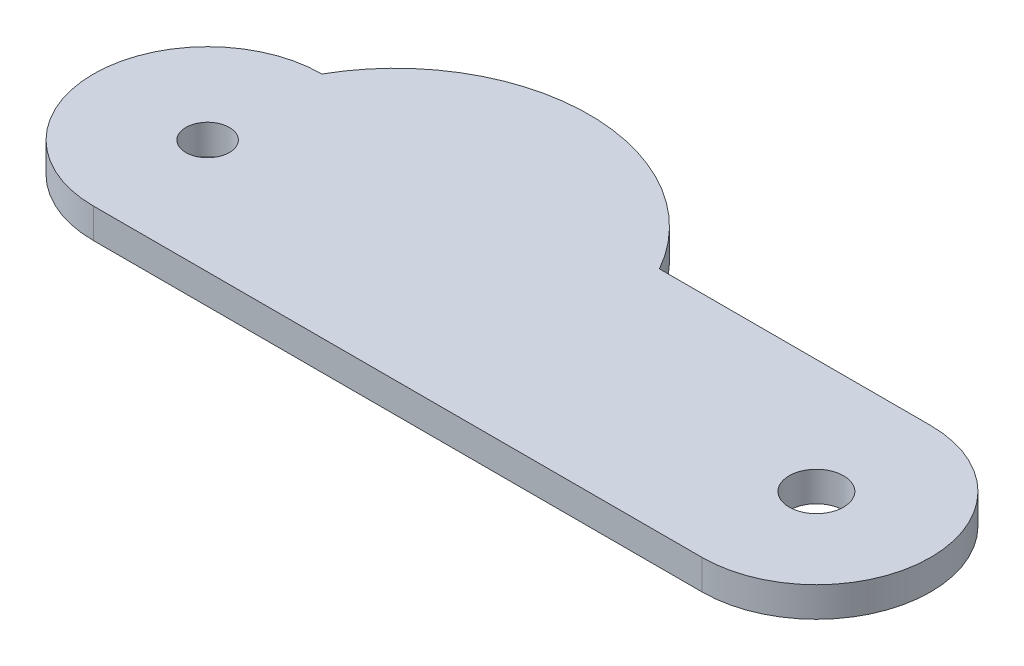
ISO-10303-21;
HEADER;
FILE_DESCRIPTION(('STEP AP214'),'2;1');
FILE_NAME('part.step','',(''),(''),'','','');
FILE_SCHEMA(('AUTOMOTIVE_DESIGN { 1 0 10303 214 1 1 1 1 }'));
ENDSEC;
DATA;
#1=APPLICATION_CONTEXT('core data for automotive mechanical design processes');
#2=APPLICATION_PROTOCOL_DEFINITION('international standard','automotive_design',2000,#1);
#3=PRODUCT_CONTEXT('',#1,'mechanical');
#4=PRODUCT('Part','Part','',(#3));
#5=PRODUCT_RELATED_PRODUCT_CATEGORY('part','',(#4));
#6=PRODUCT_DEFINITION_FORMATION('','',#4);
#7=PRODUCT_DEFINITION_CONTEXT('part definition',#1,'design');
#8=PRODUCT_DEFINITION('design','',#6,#7);
#9=PRODUCT_DEFINITION_SHAPE('','',#8);
#10=(LENGTH_UNIT() NAMED_UNIT(*) SI_UNIT(.MILLI.,.METRE.));
#11=(NAMED_UNIT(*) PLANE_ANGLE_UNIT() SI_UNIT($,.RADIAN.));
#12=(NAMED_UNIT(*) SI_UNIT($,.STERADIAN.) SOLID_ANGLE_UNIT());
#13=UNCERTAINTY_MEASURE_WITH_UNIT(LENGTH_MEASURE(1.E-05),#10,'distance_accuracy_value','');
#14=(GEOMETRIC_REPRESENTATION_CONTEXT(3) GLOBAL_UNCERTAINTY_ASSIGNED_CONTEXT((#13)) GLOBAL_UNIT_ASSIGNED_CONTEXT((#10,
#11,#12)) REPRESENTATION_CONTEXT('',''));
#15=CARTESIAN_POINT('',(0.,0.,0.));
#16=DIRECTION('',(0.,0.,1.));
#17=DIRECTION('',(1.,0.,0.));
#18=AXIS2_PLACEMENT_3D('',#15,#16,#17);
#19=CARTESIAN_POINT('',(0.,2.,0.));
#20=DIRECTION('',(0.,-1.,0.));
#21=DIRECTION('',(0.,0.,-1.));
#22=AXIS2_PLACEMENT_3D('',#19,#20,#21);
#23=PLANE('',#22);
#24=DIRECTION('',(1.,0.,0.));
#25=VECTOR('',#24,1.);
#26=CARTESIAN_POINT('',(0.,2.,10.5003992165423));
#27=LINE('',#26,#25);
#28=CARTESIAN_POINT('',(-55.9305382801715,2.,10.5003992165423));
#29=VERTEX_POINT('',#28);
#30=CARTESIAN_POINT('',(0.,2.,10.5003992165423));
#31=VERTEX_POINT('',#30);
#32=EDGE_CURVE('E84',#29,#31,#27,.T.);
#33=ORIENTED_EDGE('',*,*,#32,.F.);
#34=CARTESIAN_POINT('',(-55.9305382801715,2.,0.));
#35=DIRECTION('',(0.,-1.,0.));
#36=DIRECTION('',(0.,0.,-1.));
#37=AXIS2_PLACEMENT_3D('',#34,#35,#36);
#38=CIRCLE('',#37,10.5003992165423);
#39=CARTESIAN_POINT('',(-55.9305382801715,2.,-10.5003992165423));
#40=VERTEX_POINT('',#39);
#41=EDGE_CURVE('E88',#29,#40,#38,.T.);
#42=ORIENTED_EDGE('',*,*,#41,.T.);
#43=CARTESIAN_POINT('',(-40.4241193156667,2.,-1.7460511013579));
#44=DIRECTION('',(0.,1.,0.));
#45=DIRECTION('',(0.,0.,1.));
#46=AXIS2_PLACEMENT_3D('',#43,#44,#45);
#47=CIRCLE('',#46,17.8069548217708);
#48=CARTESIAN_POINT('',(-24.917700351162,2.,-10.5003992165423));
#49=VERTEX_POINT('',#48);
#50=EDGE_CURVE('E11',#49,#40,#47,.T.);
#51=ORIENTED_EDGE('',*,*,#50,.F.);
#52=DIRECTION('',(1.,0.,0.));
#53=VECTOR('',#52,1.);
#54=CARTESIAN_POINT('',(0.,2.,-10.5003992165423));
#55=LINE('',#54,#53);
#56=CARTESIAN_POINT('',(0.,2.,-10.5003992165423));
#57=VERTEX_POINT('',#56);
#58=EDGE_CURVE('E109',#49,#57,#55,.T.);
#59=ORIENTED_EDGE('',*,*,#58,.T.);
#60=CARTESIAN_POINT('',(0.,2.,0.));
#61=DIRECTION('',(0.,-1.,0.));
#62=DIRECTION('',(0.,0.,-1.));
#63=AXIS2_PLACEMENT_3D('',#60,#61,#62);
#64=CIRCLE('',#63,10.5003992165423);
#65=EDGE_CURVE('E91',#57,#31,#64,.T.);
#66=ORIENTED_EDGE('',*,*,#65,.T.);
#67=EDGE_LOOP('',(#33,#42,#51,#59,#66));
#68=FACE_BOUND('',#67,.T.);
#69=CARTESIAN_POINT('',(0.,2.,0.));
#70=DIRECTION('',(0.,-1.,0.));
#71=DIRECTION('',(0.,0.,-1.));
#72=AXIS2_PLACEMENT_3D('',#69,#70,#71);
#73=CIRCLE('',#72,2.5);
#74=CARTESIAN_POINT('',(0.,2.,-2.5));
#75=VERTEX_POINT('',#74);
#76=EDGE_CURVE('E136',#75,#75,#73,.T.);
#77=ORIENTED_EDGE('',*,*,#76,.F.);
#78=EDGE_LOOP('',(#77));
#79=FACE_BOUND('',#78,.T.);
#80=CARTESIAN_POINT('',(-55.9305382801715,2.,0.));
#81=DIRECTION('',(0.,-1.,0.));
#82=DIRECTION('',(0.,0.,-1.));
#83=AXIS2_PLACEMENT_3D('',#80,#81,#82);
#84=CIRCLE('',#83,2.);
#85=CARTESIAN_POINT('',(-55.9305382801715,2.,-2.));
#86=VERTEX_POINT('',#85);
#87=EDGE_CURVE('E96',#86,#86,#84,.T.);
#88=ORIENTED_EDGE('',*,*,#87,.F.);
#89=EDGE_LOOP('',(#88));
#90=FACE_BOUND('',#89,.T.);
#91=ADVANCED_FACE('F38',(#68,#79,#90),#23,.T.);
#92=CARTESIAN_POINT('',(0.,4.75,-10.5003992165423));
#93=DIRECTION('',(0.,0.,1.));
#94=DIRECTION('',(1.,0.,0.));
#95=AXIS2_PLACEMENT_3D('',#92,#93,#94);
#96=PLANE('',#95);
#97=ORIENTED_EDGE('',*,*,#58,.F.);
#98=DIRECTION('',(0.,-1.,0.));
#99=VECTOR('',#98,1.);
#100=CARTESIAN_POINT('',(-24.917700351162,37.0570550282,-10.5003992165423));
#101=LINE('',#100,#99);
#102=CARTESIAN_POINT('',(-24.917700351162,4.75,-10.5003992165423));
#103=VERTEX_POINT('',#102);
#104=EDGE_CURVE('E42',#103,#49,#101,.T.);
#105=ORIENTED_EDGE('',*,*,#104,.F.);
#106=DIRECTION('',(-1.,0.,0.));
#107=VECTOR('',#106,1.);
#108=CARTESIAN_POINT('',(0.,4.75,-10.5003992165423));
#109=LINE('',#108,#107);
#110=CARTESIAN_POINT('',(0.,4.75,-10.5003992165423));
#111=VERTEX_POINT('',#110);
#112=EDGE_CURVE('E120',#111,#103,#109,.T.);
#113=ORIENTED_EDGE('',*,*,#112,.F.);
#114=DIRECTION('',(0.,-1.,0.));
#115=VECTOR('',#114,1.);
#116=CARTESIAN_POINT('',(0.,4.75,-10.5003992165423));
#117=LINE('',#116,#115);
#118=EDGE_CURVE('E95',#111,#57,#117,.T.);
#119=ORIENTED_EDGE('',*,*,#118,.T.);
#120=EDGE_LOOP('',(#97,#105,#113,#119));
#121=FACE_BOUND('',#120,.T.);
#122=ADVANCED_FACE('F142',(#121),#96,.F.);
#123=CARTESIAN_POINT('',(0.,4.75,0.));
#124=DIRECTION('',(0.,1.,0.));
#125=DIRECTION('',(0.,0.,1.));
#126=AXIS2_PLACEMENT_3D('',#123,#124,#125);
#127=PLANE('',#126);
#128=CARTESIAN_POINT('',(0.,4.75,0.));
#129=DIRECTION('',(0.,1.,0.));
#130=DIRECTION('',(0.,0.,1.));
#131=AXIS2_PLACEMENT_3D('',#128,#129,#130);
#132=CIRCLE('',#131,2.5);
#133=CARTESIAN_POINT('',(0.,4.75,2.5));
#134=VERTEX_POINT('',#133);
#135=EDGE_CURVE('E127',#134,#134,#132,.T.);
#136=ORIENTED_EDGE('',*,*,#135,.F.);
#137=EDGE_LOOP('',(#136));
#138=FACE_BOUND('',#137,.T.);
#139=CARTESIAN_POINT('',(0.,4.75,0.));
#140=DIRECTION('',(0.,1.,0.));
#141=DIRECTION('',(0.,0.,1.));
#142=AXIS2_PLACEMENT_3D('',#139,#140,#141);
#143=CIRCLE('',#142,10.5003992165423);
#144=CARTESIAN_POINT('',(0.,4.75,10.5003992165423));
#145=VERTEX_POINT('',#144);
#146=EDGE_CURVE('E125',#145,#111,#143,.T.);
#147=ORIENTED_EDGE('',*,*,#146,.T.);
#148=ORIENTED_EDGE('',*,*,#112,.T.);
#149=CARTESIAN_POINT('',(-40.4241193156667,4.75,-1.7460511013579));
#150=DIRECTION('',(0.,1.,0.));
#151=DIRECTION('',(0.,0.,1.));
#152=AXIS2_PLACEMENT_3D('',#149,#150,#151);
#153=CIRCLE('',#152,17.8069548217708);
#154=CARTESIAN_POINT('',(-55.9305382801715,4.75,-10.5003992165423));
#155=VERTEX_POINT('',#154);
#156=EDGE_CURVE('E54',#103,#155,#153,.T.);
#157=ORIENTED_EDGE('',*,*,#156,.T.);
#158=CARTESIAN_POINT('',(-55.9305382801715,4.75,0.));
#159=DIRECTION('',(0.,1.,0.));
#160=DIRECTION('',(0.,0.,1.));
#161=AXIS2_PLACEMENT_3D('',#158,#159,#160);
#162=CIRCLE('',#161,10.5003992165423);
#163=CARTESIAN_POINT('',(-55.9305382801715,4.75,10.5003992165423));
#164=VERTEX_POINT('',#163);
#165=EDGE_CURVE('E116',#155,#164,#162,.T.);
#166=ORIENTED_EDGE('',*,*,#165,.T.);
#167=DIRECTION('',(1.,0.,0.));
#168=VECTOR('',#167,1.);
#169=CARTESIAN_POINT('',(0.,4.75,10.5003992165423));
#170=LINE('',#169,#168);
#171=EDGE_CURVE('E102',#164,#145,#170,.T.);
#172=ORIENTED_EDGE('',*,*,#171,.T.);
#173=EDGE_LOOP('',(#147,#148,#157,#166,#172));
#174=FACE_BOUND('',#173,.T.);
#175=CARTESIAN_POINT('',(-55.9305382801715,4.75,0.));
#176=DIRECTION('',(0.,1.,0.));
#177=DIRECTION('',(0.,0.,1.));
#178=AXIS2_PLACEMENT_3D('',#175,#176,#177);
#179=CIRCLE('',#178,2.);
#180=CARTESIAN_POINT('',(-55.9305382801715,4.75,2.));
#181=VERTEX_POINT('',#180);
#182=EDGE_CURVE('E130',#181,#181,#179,.T.);
#183=ORIENTED_EDGE('',*,*,#182,.F.);
#184=EDGE_LOOP('',(#183));
#185=FACE_BOUND('',#184,.T.);
#186=ADVANCED_FACE('F143',(#138,#174,#185),#127,.T.);
#187=CARTESIAN_POINT('',(-55.9305382801715,4.75,0.));
#188=DIRECTION('',(0.,-1.,0.));
#189=DIRECTION('',(0.,0.,-1.));
#190=AXIS2_PLACEMENT_3D('',#187,#188,#189);
#191=CYLINDRICAL_SURFACE('',#190,10.5003992165423);
#192=ORIENTED_EDGE('',*,*,#41,.F.);
#193=DIRECTION('',(0.,-1.,0.));
#194=VECTOR('',#193,1.);
#195=CARTESIAN_POINT('',(-55.9305382801715,4.75,10.5003992165423));
#196=LINE('',#195,#194);
#197=EDGE_CURVE('E100',#164,#29,#196,.T.);
#198=ORIENTED_EDGE('',*,*,#197,.F.);
#199=ORIENTED_EDGE('',*,*,#165,.F.);
#200=DIRECTION('',(0.,-1.,0.));
#201=VECTOR('',#200,1.);
#202=CARTESIAN_POINT('',(-55.9305382801715,4.75,-10.5003992165423));
#203=LINE('',#202,#201);
#204=EDGE_CURVE('E58',#155,#40,#203,.T.);
#205=ORIENTED_EDGE('',*,*,#204,.T.);
#206=EDGE_LOOP('',(#192,#198,#199,#205));
#207=FACE_BOUND('',#206,.T.);
#208=ADVANCED_FACE('F107',(#207),#191,.T.);
#209=CARTESIAN_POINT('',(-40.4241193156667,37.0570550282,-1.7460511013579));
#210=DIRECTION('',(0.,-1.,0.));
#211=DIRECTION('',(0.,0.,-1.));
#212=AXIS2_PLACEMENT_3D('',#209,#210,#211);
#213=CYLINDRICAL_SURFACE('',#212,17.8069548217708);
#214=ORIENTED_EDGE('',*,*,#104,.T.);
#215=ORIENTED_EDGE('',*,*,#50,.T.);
#216=ORIENTED_EDGE('',*,*,#204,.F.);
#217=ORIENTED_EDGE('',*,*,#156,.F.);
#218=EDGE_LOOP('',(#214,#215,#216,#217));
#219=FACE_BOUND('',#218,.T.);
#220=ADVANCED_FACE('F171',(#219),#213,.T.);
#221=CARTESIAN_POINT('',(0.,4.75,0.));
#222=DIRECTION('',(0.,-1.,0.));
#223=DIRECTION('',(0.,0.,-1.));
#224=AXIS2_PLACEMENT_3D('',#221,#222,#223);
#225=CYLINDRICAL_SURFACE('',#224,10.5003992165423);
#226=ORIENTED_EDGE('',*,*,#65,.F.);
#227=ORIENTED_EDGE('',*,*,#118,.F.);
#228=ORIENTED_EDGE('',*,*,#146,.F.);
#229=DIRECTION('',(0.,-1.,0.));
#230=VECTOR('',#229,1.);
#231=CARTESIAN_POINT('',(0.,4.75,10.5003992165423));
#232=LINE('',#231,#230);
#233=EDGE_CURVE('E105',#145,#31,#232,.T.);
#234=ORIENTED_EDGE('',*,*,#233,.T.);
#235=EDGE_LOOP('',(#226,#227,#228,#234));
#236=FACE_BOUND('',#235,.T.);
#237=ADVANCED_FACE('F141',(#236),#225,.T.);
#238=CARTESIAN_POINT('',(0.,4.75,10.5003992165423));
#239=DIRECTION('',(0.,0.,-1.));
#240=DIRECTION('',(-1.,0.,0.));
#241=AXIS2_PLACEMENT_3D('',#238,#239,#240);
#242=PLANE('',#241);
#243=ORIENTED_EDGE('',*,*,#32,.T.);
#244=ORIENTED_EDGE('',*,*,#233,.F.);
#245=ORIENTED_EDGE('',*,*,#171,.F.);
#246=ORIENTED_EDGE('',*,*,#197,.T.);
#247=EDGE_LOOP('',(#243,#244,#245,#246));
#248=FACE_BOUND('',#247,.T.);
#249=ADVANCED_FACE('F101',(#248),#242,.F.);
#250=CARTESIAN_POINT('',(-55.9305382801715,4.75,0.));
#251=DIRECTION('',(0.,-1.,0.));
#252=DIRECTION('',(0.,0.,-1.));
#253=AXIS2_PLACEMENT_3D('',#250,#251,#252);
#254=CYLINDRICAL_SURFACE('',#253,2.);
#255=ORIENTED_EDGE('',*,*,#182,.T.);
#256=EDGE_LOOP('',(#255));
#257=FACE_BOUND('',#256,.T.);
#258=ORIENTED_EDGE('',*,*,#87,.T.);
#259=EDGE_LOOP('',(#258));
#260=FACE_BOUND('',#259,.T.);
#261=ADVANCED_FACE('F40',(#257,#260),#254,.F.);
#262=CARTESIAN_POINT('',(0.,4.75,0.));
#263=DIRECTION('',(0.,-1.,0.));
#264=DIRECTION('',(0.,0.,-1.));
#265=AXIS2_PLACEMENT_3D('',#262,#263,#264);
#266=CYLINDRICAL_SURFACE('',#265,2.5);
#267=ORIENTED_EDGE('',*,*,#135,.T.);
#268=EDGE_LOOP('',(#267));
#269=FACE_BOUND('',#268,.T.);
#270=ORIENTED_EDGE('',*,*,#76,.T.);
#271=EDGE_LOOP('',(#270));
#272=FACE_BOUND('',#271,.T.);
#273=ADVANCED_FACE('F152',(#269,#272),#266,.F.);
#274=CLOSED_SHELL('',(#91,#122,#186,#208,#220,#237,#249,#261,#273));
#275=MANIFOLD_SOLID_BREP('B2',#274);
#276=ADVANCED_BREP_SHAPE_REPRESENTATION('',(#18,#275),#14);
#277=SHAPE_DEFINITION_REPRESENTATION(#9,#276);
ENDSEC;
END-ISO-10303-21;
